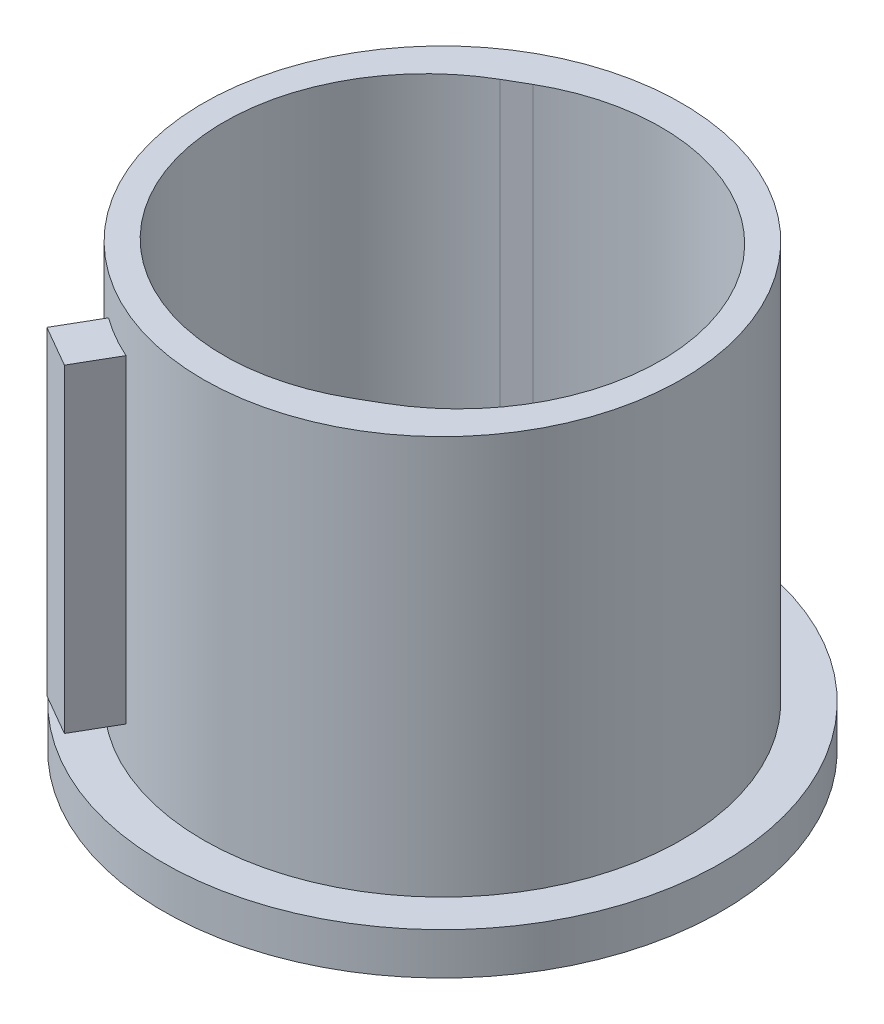
ISO-10303-21;
HEADER;
FILE_DESCRIPTION(('STEP AP214'),'2;1');
FILE_NAME('part.step','',(''),(''),'','','');
FILE_SCHEMA(('AUTOMOTIVE_DESIGN { 1 0 10303 214 1 1 1 1 }'));
ENDSEC;
DATA;
#1=APPLICATION_CONTEXT('core data for automotive mechanical design processes');
#2=APPLICATION_PROTOCOL_DEFINITION('international standard','automotive_design',2000,#1);
#3=PRODUCT_CONTEXT('',#1,'mechanical');
#4=PRODUCT('Part','Part','',(#3));
#5=PRODUCT_RELATED_PRODUCT_CATEGORY('part','',(#4));
#6=PRODUCT_DEFINITION_FORMATION('','',#4);
#7=PRODUCT_DEFINITION_CONTEXT('part definition',#1,'design');
#8=PRODUCT_DEFINITION('design','',#6,#7);
#9=PRODUCT_DEFINITION_SHAPE('','',#8);
#10=(LENGTH_UNIT() NAMED_UNIT(*) SI_UNIT(.MILLI.,.METRE.));
#11=(NAMED_UNIT(*) PLANE_ANGLE_UNIT() SI_UNIT($,.RADIAN.));
#12=(NAMED_UNIT(*) SI_UNIT($,.STERADIAN.) SOLID_ANGLE_UNIT());
#13=UNCERTAINTY_MEASURE_WITH_UNIT(LENGTH_MEASURE(1.E-05),#10,'distance_accuracy_value','');
#14=(GEOMETRIC_REPRESENTATION_CONTEXT(3) GLOBAL_UNCERTAINTY_ASSIGNED_CONTEXT((#13)) GLOBAL_UNIT_ASSIGNED_CONTEXT((#10,
#11,#12)) REPRESENTATION_CONTEXT('',''));
#15=CARTESIAN_POINT('',(0.,0.,0.));
#16=DIRECTION('',(0.,0.,1.));
#17=DIRECTION('',(1.,0.,0.));
#18=AXIS2_PLACEMENT_3D('',#15,#16,#17);
#19=CARTESIAN_POINT('',(-74.2916512459885,105.98,31.1769145362398));
#20=DIRECTION('',(0.,-1.,0.));
#21=DIRECTION('',(-0.866025403784439,0.,-0.5));
#22=AXIS2_PLACEMENT_3D('',#19,#20,#21);
#23=PLANE('',#22);
#24=CARTESIAN_POINT('',(-74.2916512459885,105.98,31.1769145362398));
#25=DIRECTION('',(0.,1.,0.));
#26=DIRECTION('',(-0.866025403784439,0.,-0.5));
#27=AXIS2_PLACEMENT_3D('',#24,#25,#26);
#28=CIRCLE('',#27,6.);
#29=CARTESIAN_POINT('',(-79.4878036686952,105.98,28.1769145362398));
#30=VERTEX_POINT('',#29);
#31=EDGE_CURVE('E153',#30,#30,#28,.T.);
#32=ORIENTED_EDGE('',*,*,#31,.T.);
#33=EDGE_LOOP('',(#32));
#34=FACE_BOUND('',#33,.T.);
#35=CARTESIAN_POINT('',(-74.0318436248532,105.98,31.0269145362398));
#36=DIRECTION('',(0.,1.,0.));
#37=DIRECTION('',(-0.866025403784439,0.,-0.5));
#38=AXIS2_PLACEMENT_3D('',#35,#36,#37);
#39=CIRCLE('',#38,5.07);
#40=CARTESIAN_POINT('',(-76.5668436248532,105.98,26.6361657390527));
#41=VERTEX_POINT('',#40);
#42=CARTESIAN_POINT('',(-71.4968436248532,105.98,35.4176633334269));
#43=VERTEX_POINT('',#42);
#44=EDGE_CURVE('E150',#41,#43,#39,.F.);
#45=ORIENTED_EDGE('',*,*,#44,.T.);
#46=DIRECTION('',(-0.866025403784439,0.,0.499999999999999));
#47=VECTOR('',#46,1.);
#48=CARTESIAN_POINT('',(-71.7566512459885,105.98,35.5676633334269));
#49=LINE('',#48,#47);
#50=CARTESIAN_POINT('',(-72.0164588671238,105.98,35.7176633334269));
#51=VERTEX_POINT('',#50);
#52=EDGE_CURVE('E138',#43,#51,#49,.T.);
#53=ORIENTED_EDGE('',*,*,#52,.T.);
#54=CARTESIAN_POINT('',(-74.5514588671238,105.98,31.3269145362398));
#55=DIRECTION('',(0.,1.,0.));
#56=DIRECTION('',(-0.866025403784439,0.,-0.5));
#57=AXIS2_PLACEMENT_3D('',#54,#55,#56);
#58=CIRCLE('',#57,5.07);
#59=CARTESIAN_POINT('',(-77.0864588671238,105.98,26.9361657390527));
#60=VERTEX_POINT('',#59);
#61=EDGE_CURVE('E142',#51,#60,#58,.F.);
#62=ORIENTED_EDGE('',*,*,#61,.T.);
#63=DIRECTION('',(0.866025403784439,0.,-0.499999999999999));
#64=VECTOR('',#63,1.);
#65=CARTESIAN_POINT('',(-76.8266512459885,105.98,26.7861657390527));
#66=LINE('',#65,#64);
#67=EDGE_CURVE('E144',#60,#41,#66,.T.);
#68=ORIENTED_EDGE('',*,*,#67,.T.);
#69=EDGE_LOOP('',(#45,#53,#62,#68));
#70=FACE_BOUND('',#69,.T.);
#71=ADVANCED_FACE('F41',(#34,#70),#23,.F.);
#72=CARTESIAN_POINT('',(-74.2916512459885,94.93,31.1769145362398));
#73=DIRECTION('',(0.,-1.,0.));
#74=DIRECTION('',(-0.866025403784439,0.,-0.5));
#75=AXIS2_PLACEMENT_3D('',#72,#73,#74);
#76=PLANE('',#75);
#77=CARTESIAN_POINT('',(-74.2916512459885,94.93,31.1769145362398));
#78=DIRECTION('',(0.,1.,0.));
#79=DIRECTION('',(-0.866025403784439,0.,-0.5));
#80=AXIS2_PLACEMENT_3D('',#77,#78,#79);
#81=CIRCLE('',#80,7.);
#82=CARTESIAN_POINT('',(-80.3538290724796,94.93,27.6769145362398));
#83=VERTEX_POINT('',#82);
#84=EDGE_CURVE('E154',#83,#83,#81,.T.);
#85=ORIENTED_EDGE('',*,*,#84,.F.);
#86=EDGE_LOOP('',(#85));
#87=FACE_BOUND('',#86,.T.);
#88=DIRECTION('',(0.866025403784439,0.,-0.499999999999999));
#89=VECTOR('',#88,1.);
#90=CARTESIAN_POINT('',(-76.8266512459885,94.93,26.7861657390527));
#91=LINE('',#90,#89);
#92=CARTESIAN_POINT('',(-77.0864588671238,94.93,26.9361657390527));
#93=VERTEX_POINT('',#92);
#94=CARTESIAN_POINT('',(-76.5668436248532,94.93,26.6361657390527));
#95=VERTEX_POINT('',#94);
#96=EDGE_CURVE('E166',#93,#95,#91,.T.);
#97=ORIENTED_EDGE('',*,*,#96,.F.);
#98=CARTESIAN_POINT('',(-74.5514588671238,94.93,31.3269145362398));
#99=DIRECTION('',(0.,1.,0.));
#100=DIRECTION('',(-0.866025403784439,0.,-0.5));
#101=AXIS2_PLACEMENT_3D('',#98,#99,#100);
#102=CIRCLE('',#101,5.07);
#103=CARTESIAN_POINT('',(-72.0164588671238,94.93,35.7176633334269));
#104=VERTEX_POINT('',#103);
#105=EDGE_CURVE('E164',#104,#93,#102,.F.);
#106=ORIENTED_EDGE('',*,*,#105,.F.);
#107=DIRECTION('',(-0.866025403784439,0.,0.499999999999999));
#108=VECTOR('',#107,1.);
#109=CARTESIAN_POINT('',(-71.7566512459885,94.93,35.5676633334269));
#110=LINE('',#109,#108);
#111=CARTESIAN_POINT('',(-71.4968436248532,94.93,35.4176633334269));
#112=VERTEX_POINT('',#111);
#113=EDGE_CURVE('E156',#112,#104,#110,.T.);
#114=ORIENTED_EDGE('',*,*,#113,.F.);
#115=CARTESIAN_POINT('',(-74.0318436248532,94.93,31.0269145362398));
#116=DIRECTION('',(0.,1.,0.));
#117=DIRECTION('',(-0.866025403784439,0.,-0.5));
#118=AXIS2_PLACEMENT_3D('',#115,#116,#117);
#119=CIRCLE('',#118,5.07);
#120=EDGE_CURVE('E171',#95,#112,#119,.F.);
#121=ORIENTED_EDGE('',*,*,#120,.F.);
#122=EDGE_LOOP('',(#97,#106,#114,#121));
#123=FACE_BOUND('',#122,.T.);
#124=ADVANCED_FACE('F191',(#87,#123),#76,.T.);
#125=CARTESIAN_POINT('',(-74.2916512459885,95.98,31.1769145362398));
#126=DIRECTION('',(0.,1.,0.));
#127=DIRECTION('',(0.866025403784439,0.,0.5));
#128=AXIS2_PLACEMENT_3D('',#125,#126,#127);
#129=CYLINDRICAL_SURFACE('',#128,6.);
#130=DIRECTION('',(0.,1.,0.));
#131=VECTOR('',#130,1.);
#132=CARTESIAN_POINT('',(-77.796228799579,95.98,36.047020918124));
#133=LINE('',#132,#131);
#134=CARTESIAN_POINT('',(-77.796228799579,97.,36.047020918124));
#135=VERTEX_POINT('',#134);
#136=CARTESIAN_POINT('',(-77.796228799579,105.,36.047020918124));
#137=VERTEX_POINT('',#136);
#138=EDGE_CURVE('E47',#135,#137,#133,.T.);
#139=ORIENTED_EDGE('',*,*,#138,.T.);
#140=CARTESIAN_POINT('',(-74.2916512459885,105.,31.1769145362398));
#141=DIRECTION('',(0.,1.,0.));
#142=DIRECTION('',(-0.866025403784439,0.,-0.5));
#143=AXIS2_PLACEMENT_3D('',#140,#141,#142);
#144=CIRCLE('',#143,6.);
#145=CARTESIAN_POINT('',(-76.7569983150377,105.,36.647020918124));
#146=VERTEX_POINT('',#145);
#147=EDGE_CURVE('E172',#137,#146,#144,.T.);
#148=ORIENTED_EDGE('',*,*,#147,.T.);
#149=DIRECTION('',(0.,1.,0.));
#150=VECTOR('',#149,1.);
#151=CARTESIAN_POINT('',(-76.7569983150377,95.98,36.647020918124));
#152=LINE('',#151,#150);
#153=CARTESIAN_POINT('',(-76.7569983150377,97.,36.647020918124));
#154=VERTEX_POINT('',#153);
#155=EDGE_CURVE('E180',#146,#154,#152,.F.);
#156=ORIENTED_EDGE('',*,*,#155,.T.);
#157=CARTESIAN_POINT('',(-74.2916512459885,97.,31.1769145362398));
#158=DIRECTION('',(0.,1.,0.));
#159=DIRECTION('',(-0.866025403784439,0.,-0.5));
#160=AXIS2_PLACEMENT_3D('',#157,#158,#159);
#161=CIRCLE('',#160,6.);
#162=EDGE_CURVE('E11',#135,#154,#161,.T.);
#163=ORIENTED_EDGE('',*,*,#162,.F.);
#164=EDGE_LOOP('',(#139,#148,#156,#163));
#165=FACE_BOUND('',#164,.T.);
#166=CARTESIAN_POINT('',(-74.2916512459885,95.98,31.1769145362398));
#167=DIRECTION('',(0.,1.,0.));
#168=DIRECTION('',(-0.866025403784439,0.,-0.5));
#169=AXIS2_PLACEMENT_3D('',#166,#167,#168);
#170=CIRCLE('',#169,6.);
#171=CARTESIAN_POINT('',(-79.4878036686952,95.98,28.1769145362398));
#172=VERTEX_POINT('',#171);
#173=EDGE_CURVE('E160',#172,#172,#170,.T.);
#174=ORIENTED_EDGE('',*,*,#173,.T.);
#175=EDGE_LOOP('',(#174));
#176=FACE_BOUND('',#175,.T.);
#177=ORIENTED_EDGE('',*,*,#31,.F.);
#178=EDGE_LOOP('',(#177));
#179=FACE_BOUND('',#178,.T.);
#180=ADVANCED_FACE('F43',(#165,#176,#179),#129,.T.);
#181=CARTESIAN_POINT('',(-74.2916512459885,94.93,31.1769145362398));
#182=DIRECTION('',(0.,1.,0.));
#183=DIRECTION('',(0.866025403784439,0.,0.5));
#184=AXIS2_PLACEMENT_3D('',#181,#182,#183);
#185=CYLINDRICAL_SURFACE('',#184,7.);
#186=ORIENTED_EDGE('',*,*,#84,.T.);
#187=EDGE_LOOP('',(#186));
#188=FACE_BOUND('',#187,.T.);
#189=CARTESIAN_POINT('',(-74.2916512459885,95.98,31.1769145362398));
#190=DIRECTION('',(0.,1.,0.));
#191=DIRECTION('',(-0.866025403784439,0.,-0.5));
#192=AXIS2_PLACEMENT_3D('',#189,#190,#191);
#193=CIRCLE('',#192,7.);
#194=CARTESIAN_POINT('',(-80.3538290724796,95.98,27.6769145362398));
#195=VERTEX_POINT('',#194);
#196=EDGE_CURVE('E148',#195,#195,#193,.T.);
#197=ORIENTED_EDGE('',*,*,#196,.F.);
#198=EDGE_LOOP('',(#197));
#199=FACE_BOUND('',#198,.T.);
#200=ADVANCED_FACE('F203',(#188,#199),#185,.T.);
#201=CARTESIAN_POINT('',(-74.2916512459885,95.98,31.1769145362398));
#202=DIRECTION('',(0.,-1.,0.));
#203=DIRECTION('',(-0.866025403784439,0.,-0.5));
#204=AXIS2_PLACEMENT_3D('',#201,#202,#203);
#205=PLANE('',#204);
#206=ORIENTED_EDGE('',*,*,#173,.F.);
#207=EDGE_LOOP('',(#206));
#208=FACE_BOUND('',#207,.T.);
#209=ORIENTED_EDGE('',*,*,#196,.T.);
#210=EDGE_LOOP('',(#209));
#211=FACE_BOUND('',#210,.T.);
#212=ADVANCED_FACE('F207',(#208,#211),#205,.F.);
#213=CARTESIAN_POINT('',(-74.0318436248532,94.83,31.0269145362398));
#214=DIRECTION('',(0.,1.,0.));
#215=DIRECTION('',(0.866025403784439,0.,0.5));
#216=AXIS2_PLACEMENT_3D('',#213,#214,#215);
#217=CYLINDRICAL_SURFACE('',#216,5.07);
#218=ORIENTED_EDGE('',*,*,#44,.F.);
#219=DIRECTION('',(0.,1.,0.));
#220=VECTOR('',#219,1.);
#221=CARTESIAN_POINT('',(-76.5668436248532,94.83,26.6361657390527));
#222=LINE('',#221,#220);
#223=EDGE_CURVE('E137',#95,#41,#222,.T.);
#224=ORIENTED_EDGE('',*,*,#223,.F.);
#225=ORIENTED_EDGE('',*,*,#120,.T.);
#226=DIRECTION('',(0.,1.,0.));
#227=VECTOR('',#226,1.);
#228=CARTESIAN_POINT('',(-71.4968436248532,94.83,35.4176633334269));
#229=LINE('',#228,#227);
#230=EDGE_CURVE('E116',#112,#43,#229,.T.);
#231=ORIENTED_EDGE('',*,*,#230,.T.);
#232=EDGE_LOOP('',(#218,#224,#225,#231));
#233=FACE_BOUND('',#232,.T.);
#234=ADVANCED_FACE('F209',(#233),#217,.F.);
#235=CARTESIAN_POINT('',(-76.5668436248532,94.83,26.6361657390527));
#236=DIRECTION('',(0.499999999999999,0.,0.866025403784439));
#237=DIRECTION('',(0.866025403784439,0.,-0.499999999999999));
#238=AXIS2_PLACEMENT_3D('',#235,#236,#237);
#239=PLANE('',#238);
#240=ORIENTED_EDGE('',*,*,#67,.F.);
#241=DIRECTION('',(0.,1.,0.));
#242=VECTOR('',#241,1.);
#243=CARTESIAN_POINT('',(-77.0864588671238,94.83,26.9361657390527));
#244=LINE('',#243,#242);
#245=EDGE_CURVE('E133',#93,#60,#244,.T.);
#246=ORIENTED_EDGE('',*,*,#245,.F.);
#247=ORIENTED_EDGE('',*,*,#96,.T.);
#248=ORIENTED_EDGE('',*,*,#223,.T.);
#249=EDGE_LOOP('',(#240,#246,#247,#248));
#250=FACE_BOUND('',#249,.T.);
#251=ADVANCED_FACE('F211',(#250),#239,.T.);
#252=CARTESIAN_POINT('',(-74.5514588671238,94.83,31.3269145362398));
#253=DIRECTION('',(0.,1.,0.));
#254=DIRECTION('',(0.866025403784439,0.,0.5));
#255=AXIS2_PLACEMENT_3D('',#252,#253,#254);
#256=CYLINDRICAL_SURFACE('',#255,5.07);
#257=ORIENTED_EDGE('',*,*,#61,.F.);
#258=DIRECTION('',(0.,1.,0.));
#259=VECTOR('',#258,1.);
#260=CARTESIAN_POINT('',(-72.0164588671238,94.83,35.7176633334269));
#261=LINE('',#260,#259);
#262=EDGE_CURVE('E131',#104,#51,#261,.T.);
#263=ORIENTED_EDGE('',*,*,#262,.F.);
#264=ORIENTED_EDGE('',*,*,#105,.T.);
#265=ORIENTED_EDGE('',*,*,#245,.T.);
#266=EDGE_LOOP('',(#257,#263,#264,#265));
#267=FACE_BOUND('',#266,.T.);
#268=ADVANCED_FACE('F220',(#267),#256,.F.);
#269=CARTESIAN_POINT('',(-72.0164588671238,94.83,35.7176633334269));
#270=DIRECTION('',(-0.499999999999999,0.,-0.866025403784439));
#271=DIRECTION('',(-0.866025403784439,0.,0.499999999999999));
#272=AXIS2_PLACEMENT_3D('',#269,#270,#271);
#273=PLANE('',#272);
#274=ORIENTED_EDGE('',*,*,#52,.F.);
#275=ORIENTED_EDGE('',*,*,#230,.F.);
#276=ORIENTED_EDGE('',*,*,#113,.T.);
#277=ORIENTED_EDGE('',*,*,#262,.T.);
#278=EDGE_LOOP('',(#274,#275,#276,#277));
#279=FACE_BOUND('',#278,.T.);
#280=ADVANCED_FACE('F225',(#279),#273,.T.);
#281=CARTESIAN_POINT('',(-77.7112664882592,97.,35.8998618781895));
#282=DIRECTION('',(0.866025403784439,0.,0.5));
#283=DIRECTION('',(0.5,0.,-0.866025403784439));
#284=AXIS2_PLACEMENT_3D('',#281,#282,#283);
#285=PLANE('',#284);
#286=DIRECTION('',(-0.5,0.,0.866025403784439));
#287=VECTOR('',#286,1.);
#288=CARTESIAN_POINT('',(-77.7112664882592,97.,35.8998618781895));
#289=LINE('',#288,#287);
#290=CARTESIAN_POINT('',(-78.3612664882592,97.,37.0256949031093));
#291=VERTEX_POINT('',#290);
#292=EDGE_CURVE('E54',#135,#291,#289,.T.);
#293=ORIENTED_EDGE('',*,*,#292,.T.);
#294=DIRECTION('',(0.,1.,0.));
#295=VECTOR('',#294,1.);
#296=CARTESIAN_POINT('',(-78.3612664882592,97.,37.0256949031093));
#297=LINE('',#296,#295);
#298=CARTESIAN_POINT('',(-78.3612664882592,105.,37.0256949031093));
#299=VERTEX_POINT('',#298);
#300=EDGE_CURVE('E111',#291,#299,#297,.T.);
#301=ORIENTED_EDGE('',*,*,#300,.T.);
#302=DIRECTION('',(-0.5,0.,0.866025403784439));
#303=VECTOR('',#302,1.);
#304=CARTESIAN_POINT('',(-77.7112664882592,105.,35.8998618781895));
#305=LINE('',#304,#303);
#306=EDGE_CURVE('E130',#137,#299,#305,.T.);
#307=ORIENTED_EDGE('',*,*,#306,.F.);
#308=ORIENTED_EDGE('',*,*,#138,.F.);
#309=EDGE_LOOP('',(#293,#301,#307,#308));
#310=FACE_BOUND('',#309,.T.);
#311=ADVANCED_FACE('F119',(#310),#285,.F.);
#312=CARTESIAN_POINT('',(-77.3220360037179,97.,37.6256949031093));
#313=DIRECTION('',(-0.866025403784439,0.,-0.5));
#314=DIRECTION('',(-0.5,0.,0.866025403784439));
#315=AXIS2_PLACEMENT_3D('',#312,#313,#314);
#316=PLANE('',#315);
#317=DIRECTION('',(0.5,0.,-0.866025403784439));
#318=VECTOR('',#317,1.);
#319=CARTESIAN_POINT('',(-77.3220360037179,105.,37.6256949031093));
#320=LINE('',#319,#318);
#321=CARTESIAN_POINT('',(-77.3220360037179,105.,37.6256949031093));
#322=VERTEX_POINT('',#321);
#323=EDGE_CURVE('E125',#322,#146,#320,.T.);
#324=ORIENTED_EDGE('',*,*,#323,.F.);
#325=DIRECTION('',(0.,1.,0.));
#326=VECTOR('',#325,1.);
#327=CARTESIAN_POINT('',(-77.3220360037179,97.,37.6256949031093));
#328=LINE('',#327,#326);
#329=CARTESIAN_POINT('',(-77.3220360037179,97.,37.6256949031093));
#330=VERTEX_POINT('',#329);
#331=EDGE_CURVE('E120',#330,#322,#328,.T.);
#332=ORIENTED_EDGE('',*,*,#331,.F.);
#333=DIRECTION('',(0.5,0.,-0.866025403784439));
#334=VECTOR('',#333,1.);
#335=CARTESIAN_POINT('',(-77.3220360037179,97.,37.6256949031093));
#336=LINE('',#335,#334);
#337=EDGE_CURVE('E64',#330,#154,#336,.T.);
#338=ORIENTED_EDGE('',*,*,#337,.T.);
#339=ORIENTED_EDGE('',*,*,#155,.F.);
#340=EDGE_LOOP('',(#324,#332,#338,#339));
#341=FACE_BOUND('',#340,.T.);
#342=ADVANCED_FACE('F182',(#341),#316,.F.);
#343=CARTESIAN_POINT('',(-78.3612664882592,97.,37.0256949031093));
#344=DIRECTION('',(0.5,0.,-0.866025403784439));
#345=DIRECTION('',(-0.866025403784439,0.,-0.5));
#346=AXIS2_PLACEMENT_3D('',#343,#344,#345);
#347=PLANE('',#346);
#348=DIRECTION('',(0.866025403784439,0.,0.5));
#349=VECTOR('',#348,1.);
#350=CARTESIAN_POINT('',(-78.3612664882592,105.,37.0256949031093));
#351=LINE('',#350,#349);
#352=EDGE_CURVE('E113',#299,#322,#351,.T.);
#353=ORIENTED_EDGE('',*,*,#352,.F.);
#354=ORIENTED_EDGE('',*,*,#300,.F.);
#355=DIRECTION('',(0.866025403784439,0.,0.5));
#356=VECTOR('',#355,1.);
#357=CARTESIAN_POINT('',(-78.3612664882592,97.,37.0256949031093));
#358=LINE('',#357,#356);
#359=EDGE_CURVE('E104',#291,#330,#358,.T.);
#360=ORIENTED_EDGE('',*,*,#359,.T.);
#361=ORIENTED_EDGE('',*,*,#331,.T.);
#362=EDGE_LOOP('',(#353,#354,#360,#361));
#363=FACE_BOUND('',#362,.T.);
#364=ADVANCED_FACE('F115',(#363),#347,.F.);
#365=CARTESIAN_POINT('',(-84.4374768689828,97.,48.75));
#366=DIRECTION('',(0.,-1.,0.));
#367=DIRECTION('',(-0.866025403784439,0.,-0.5));
#368=AXIS2_PLACEMENT_3D('',#365,#366,#367);
#369=PLANE('',#368);
#370=ORIENTED_EDGE('',*,*,#162,.T.);
#371=ORIENTED_EDGE('',*,*,#337,.F.);
#372=ORIENTED_EDGE('',*,*,#359,.F.);
#373=ORIENTED_EDGE('',*,*,#292,.F.);
#374=EDGE_LOOP('',(#370,#371,#372,#373));
#375=FACE_BOUND('',#374,.T.);
#376=ADVANCED_FACE('F106',(#375),#369,.T.);
#377=CARTESIAN_POINT('',(-84.4374768689828,105.,48.75));
#378=DIRECTION('',(0.,-1.,0.));
#379=DIRECTION('',(-0.866025403784439,0.,-0.5));
#380=AXIS2_PLACEMENT_3D('',#377,#378,#379);
#381=PLANE('',#380);
#382=ORIENTED_EDGE('',*,*,#306,.T.);
#383=ORIENTED_EDGE('',*,*,#352,.T.);
#384=ORIENTED_EDGE('',*,*,#323,.T.);
#385=ORIENTED_EDGE('',*,*,#147,.F.);
#386=EDGE_LOOP('',(#382,#383,#384,#385));
#387=FACE_BOUND('',#386,.T.);
#388=ADVANCED_FACE('F184',(#387),#381,.F.);
#389=CLOSED_SHELL('',(#71,#124,#180,#200,#212,#234,#251,#268,#280,#311,#342,#364,#376,#388));
#390=MANIFOLD_SOLID_BREP('B2',#389);
#391=ADVANCED_BREP_SHAPE_REPRESENTATION('',(#18,#390),#14);
#392=SHAPE_DEFINITION_REPRESENTATION(#9,#391);
ENDSEC;
END-ISO-10303-21;
